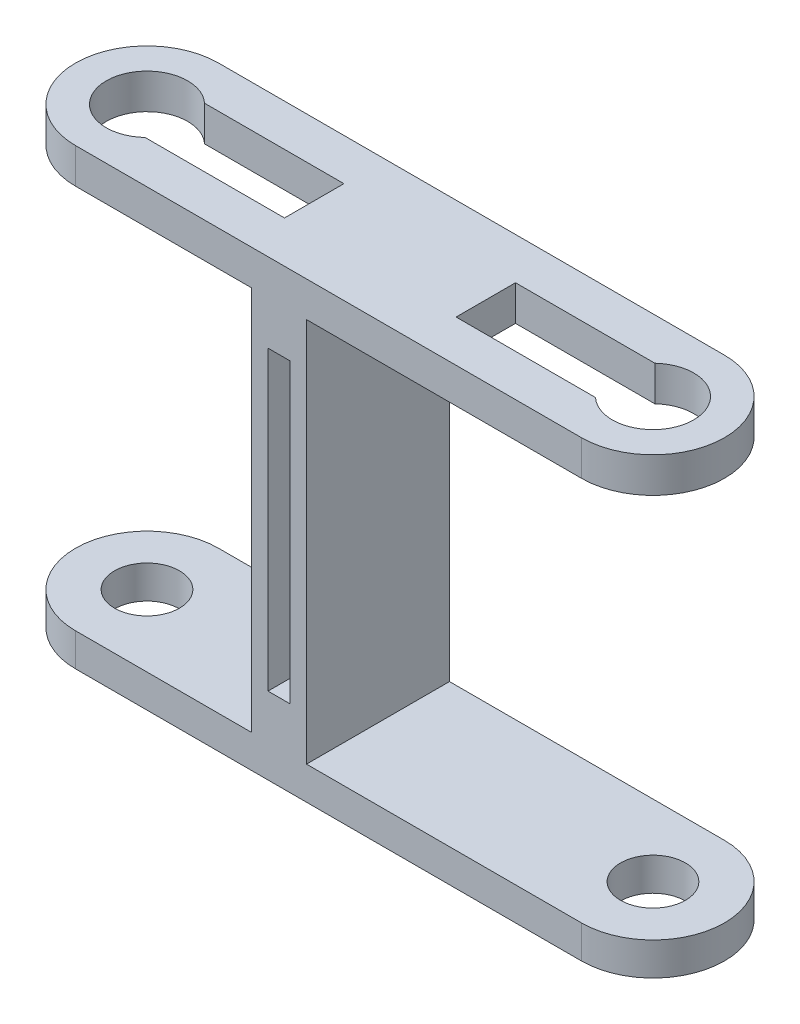
ISO-10303-21;
HEADER;
FILE_DESCRIPTION(('STEP AP214'),'2;1');
FILE_NAME('part.step','',(''),(''),'','','');
FILE_SCHEMA(('AUTOMOTIVE_DESIGN { 1 0 10303 214 1 1 1 1 }'));
ENDSEC;
DATA;
#1=APPLICATION_CONTEXT('core data for automotive mechanical design processes');
#2=APPLICATION_PROTOCOL_DEFINITION('international standard','automotive_design',2000,#1);
#3=PRODUCT_CONTEXT('',#1,'mechanical');
#4=PRODUCT('Part','Part','',(#3));
#5=PRODUCT_RELATED_PRODUCT_CATEGORY('part','',(#4));
#6=PRODUCT_DEFINITION_FORMATION('','',#4);
#7=PRODUCT_DEFINITION_CONTEXT('part definition',#1,'design');
#8=PRODUCT_DEFINITION('design','',#6,#7);
#9=PRODUCT_DEFINITION_SHAPE('','',#8);
#10=(LENGTH_UNIT() NAMED_UNIT(*) SI_UNIT(.MILLI.,.METRE.));
#11=(NAMED_UNIT(*) PLANE_ANGLE_UNIT() SI_UNIT($,.RADIAN.));
#12=(NAMED_UNIT(*) SI_UNIT($,.STERADIAN.) SOLID_ANGLE_UNIT());
#13=UNCERTAINTY_MEASURE_WITH_UNIT(LENGTH_MEASURE(1.E-05),#10,'distance_accuracy_value','');
#14=(GEOMETRIC_REPRESENTATION_CONTEXT(3) GLOBAL_UNCERTAINTY_ASSIGNED_CONTEXT((#13)) GLOBAL_UNIT_ASSIGNED_CONTEXT((#10,
#11,#12)) REPRESENTATION_CONTEXT('',''));
#15=CARTESIAN_POINT('',(0.,0.,0.));
#16=DIRECTION('',(0.,0.,1.));
#17=DIRECTION('',(1.,0.,0.));
#18=AXIS2_PLACEMENT_3D('',#15,#16,#17);
#19=CARTESIAN_POINT('',(0.,41.5,0.));
#20=DIRECTION('',(0.,1.,0.));
#21=DIRECTION('',(0.,0.,1.));
#22=AXIS2_PLACEMENT_3D('',#19,#20,#21);
#23=PLANE('',#22);
#24=CARTESIAN_POINT('',(46.,41.5,0.));
#25=DIRECTION('',(0.,1.,0.));
#26=DIRECTION('',(0.,0.,1.));
#27=AXIS2_PLACEMENT_3D('',#24,#25,#26);
#28=CIRCLE('',#27,3.7);
#29=CARTESIAN_POINT('',(43.4701778718653,41.5,2.7));
#30=VERTEX_POINT('',#29);
#31=CARTESIAN_POINT('',(43.4701778718653,41.5,-2.7));
#32=VERTEX_POINT('',#31);
#33=EDGE_CURVE('E391',#30,#32,#28,.T.);
#34=ORIENTED_EDGE('',*,*,#33,.T.);
#35=DIRECTION('',(-1.,0.,0.));
#36=VECTOR('',#35,1.);
#37=CARTESIAN_POINT('',(30.8,41.5,-2.7));
#38=LINE('',#37,#36);
#39=CARTESIAN_POINT('',(30.8,41.5,-2.7));
#40=VERTEX_POINT('',#39);
#41=EDGE_CURVE('E364',#32,#40,#38,.T.);
#42=ORIENTED_EDGE('',*,*,#41,.T.);
#43=DIRECTION('',(0.,0.,1.));
#44=VECTOR('',#43,1.);
#45=CARTESIAN_POINT('',(30.8,41.5,2.7));
#46=LINE('',#45,#44);
#47=CARTESIAN_POINT('',(30.8,41.5,2.7));
#48=VERTEX_POINT('',#47);
#49=EDGE_CURVE('E355',#40,#48,#46,.T.);
#50=ORIENTED_EDGE('',*,*,#49,.T.);
#51=DIRECTION('',(1.,0.,0.));
#52=VECTOR('',#51,1.);
#53=CARTESIAN_POINT('',(30.8,41.5,2.7));
#54=LINE('',#53,#52);
#55=EDGE_CURVE('E359',#48,#30,#54,.T.);
#56=ORIENTED_EDGE('',*,*,#55,.T.);
#57=EDGE_LOOP('',(#34,#42,#50,#56));
#58=FACE_BOUND('',#57,.T.);
#59=DIRECTION('',(0.,0.,1.));
#60=VECTOR('',#59,1.);
#61=CARTESIAN_POINT('',(21.,41.5,0.));
#62=LINE('',#61,#60);
#63=CARTESIAN_POINT('',(21.,41.5,-6.5));
#64=VERTEX_POINT('',#63);
#65=CARTESIAN_POINT('',(21.,41.5,6.5));
#66=VERTEX_POINT('',#65);
#67=EDGE_CURVE('E320',#64,#66,#62,.T.);
#68=ORIENTED_EDGE('',*,*,#67,.F.);
#69=DIRECTION('',(-1.,0.,0.));
#70=VECTOR('',#69,1.);
#71=CARTESIAN_POINT('',(0.,41.5,-6.5));
#72=LINE('',#71,#70);
#73=CARTESIAN_POINT('',(46.,41.5,-6.5));
#74=VERTEX_POINT('',#73);
#75=EDGE_CURVE('E409',#74,#64,#72,.T.);
#76=ORIENTED_EDGE('',*,*,#75,.F.);
#77=CARTESIAN_POINT('',(46.,41.5,0.));
#78=DIRECTION('',(0.,1.,0.));
#79=DIRECTION('',(0.,0.,1.));
#80=AXIS2_PLACEMENT_3D('',#77,#78,#79);
#81=CIRCLE('',#80,6.5);
#82=CARTESIAN_POINT('',(46.,41.5,6.5));
#83=VERTEX_POINT('',#82);
#84=EDGE_CURVE('E386',#83,#74,#81,.T.);
#85=ORIENTED_EDGE('',*,*,#84,.F.);
#86=DIRECTION('',(1.,0.,0.));
#87=VECTOR('',#86,1.);
#88=CARTESIAN_POINT('',(0.,41.5,6.5));
#89=LINE('',#88,#87);
#90=EDGE_CURVE('E402',#66,#83,#89,.T.);
#91=ORIENTED_EDGE('',*,*,#90,.F.);
#92=EDGE_LOOP('',(#68,#76,#85,#91));
#93=FACE_BOUND('',#92,.T.);
#94=ADVANCED_FACE('F39',(#58,#93),#23,.F.);
#95=CARTESIAN_POINT('',(0.,44.7,0.));
#96=DIRECTION('',(0.,-1.,0.));
#97=DIRECTION('',(0.,0.,-1.));
#98=AXIS2_PLACEMENT_3D('',#95,#96,#97);
#99=CYLINDRICAL_SURFACE('',#98,6.5);
#100=DIRECTION('',(0.,-1.,0.));
#101=VECTOR('',#100,1.);
#102=CARTESIAN_POINT('',(0.,44.7,6.5));
#103=LINE('',#102,#101);
#104=CARTESIAN_POINT('',(0.,44.7,6.5));
#105=VERTEX_POINT('',#104);
#106=CARTESIAN_POINT('',(0.,41.5,6.5));
#107=VERTEX_POINT('',#106);
#108=EDGE_CURVE('E432',#105,#107,#103,.T.);
#109=ORIENTED_EDGE('',*,*,#108,.F.);
#110=CARTESIAN_POINT('',(0.,44.7,0.));
#111=DIRECTION('',(0.,1.,0.));
#112=DIRECTION('',(0.,0.,1.));
#113=AXIS2_PLACEMENT_3D('',#110,#111,#112);
#114=CIRCLE('',#113,6.5);
#115=CARTESIAN_POINT('',(0.,44.7,-6.5));
#116=VERTEX_POINT('',#115);
#117=EDGE_CURVE('E437',#116,#105,#114,.T.);
#118=ORIENTED_EDGE('',*,*,#117,.F.);
#119=DIRECTION('',(0.,-1.,0.));
#120=VECTOR('',#119,1.);
#121=CARTESIAN_POINT('',(0.,44.7,-6.5));
#122=LINE('',#121,#120);
#123=CARTESIAN_POINT('',(0.,41.5,-6.5));
#124=VERTEX_POINT('',#123);
#125=EDGE_CURVE('E412',#116,#124,#122,.T.);
#126=ORIENTED_EDGE('',*,*,#125,.T.);
#127=CARTESIAN_POINT('',(0.,41.5,0.));
#128=DIRECTION('',(0.,1.,0.));
#129=DIRECTION('',(0.,0.,1.));
#130=AXIS2_PLACEMENT_3D('',#127,#128,#129);
#131=CIRCLE('',#130,6.5);
#132=EDGE_CURVE('E436',#124,#107,#131,.T.);
#133=ORIENTED_EDGE('',*,*,#132,.T.);
#134=EDGE_LOOP('',(#109,#118,#126,#133));
#135=FACE_BOUND('',#134,.T.);
#136=ADVANCED_FACE('F41',(#135),#99,.T.);
#137=CARTESIAN_POINT('',(0.,44.7,0.));
#138=DIRECTION('',(0.,1.,0.));
#139=DIRECTION('',(0.,0.,1.));
#140=AXIS2_PLACEMENT_3D('',#137,#138,#139);
#141=PLANE('',#140);
#142=DIRECTION('',(1.,0.,0.));
#143=VECTOR('',#142,1.);
#144=CARTESIAN_POINT('',(0.,44.7,6.5));
#145=LINE('',#144,#143);
#146=CARTESIAN_POINT('',(46.,44.7,6.5));
#147=VERTEX_POINT('',#146);
#148=EDGE_CURVE('E405',#105,#147,#145,.T.);
#149=ORIENTED_EDGE('',*,*,#148,.T.);
#150=CARTESIAN_POINT('',(46.,44.7,0.));
#151=DIRECTION('',(0.,1.,0.));
#152=DIRECTION('',(0.,0.,1.));
#153=AXIS2_PLACEMENT_3D('',#150,#151,#152);
#154=CIRCLE('',#153,6.5);
#155=CARTESIAN_POINT('',(46.,44.7,-6.5));
#156=VERTEX_POINT('',#155);
#157=EDGE_CURVE('E398',#147,#156,#154,.T.);
#158=ORIENTED_EDGE('',*,*,#157,.T.);
#159=DIRECTION('',(-1.,0.,0.));
#160=VECTOR('',#159,1.);
#161=CARTESIAN_POINT('',(0.,44.7,-6.5));
#162=LINE('',#161,#160);
#163=EDGE_CURVE('E408',#156,#116,#162,.T.);
#164=ORIENTED_EDGE('',*,*,#163,.T.);
#165=ORIENTED_EDGE('',*,*,#117,.T.);
#166=EDGE_LOOP('',(#149,#158,#164,#165));
#167=FACE_BOUND('',#166,.T.);
#168=DIRECTION('',(-1.,0.,0.));
#169=VECTOR('',#168,1.);
#170=CARTESIAN_POINT('',(0.,44.7,-2.7));
#171=LINE('',#170,#169);
#172=CARTESIAN_POINT('',(15.2,44.7,-2.7));
#173=VERTEX_POINT('',#172);
#174=CARTESIAN_POINT('',(2.5298221281347,44.7,-2.7));
#175=VERTEX_POINT('',#174);
#176=EDGE_CURVE('E329',#173,#175,#171,.T.);
#177=ORIENTED_EDGE('',*,*,#176,.F.);
#178=DIRECTION('',(0.,0.,-1.));
#179=VECTOR('',#178,1.);
#180=CARTESIAN_POINT('',(15.2,44.7,2.7));
#181=LINE('',#180,#179);
#182=CARTESIAN_POINT('',(15.2,44.7,2.7));
#183=VERTEX_POINT('',#182);
#184=EDGE_CURVE('E341',#183,#173,#181,.T.);
#185=ORIENTED_EDGE('',*,*,#184,.F.);
#186=DIRECTION('',(1.,0.,0.));
#187=VECTOR('',#186,1.);
#188=CARTESIAN_POINT('',(0.,44.7,2.7));
#189=LINE('',#188,#187);
#190=CARTESIAN_POINT('',(2.5298221281347,44.7,2.7));
#191=VERTEX_POINT('',#190);
#192=EDGE_CURVE('E338',#191,#183,#189,.T.);
#193=ORIENTED_EDGE('',*,*,#192,.F.);
#194=CARTESIAN_POINT('',(0.,44.7,0.));
#195=DIRECTION('',(0.,1.,0.));
#196=DIRECTION('',(0.,0.,1.));
#197=AXIS2_PLACEMENT_3D('',#194,#195,#196);
#198=CIRCLE('',#197,3.7);
#199=EDGE_CURVE('E387',#175,#191,#198,.T.);
#200=ORIENTED_EDGE('',*,*,#199,.F.);
#201=EDGE_LOOP('',(#177,#185,#193,#200));
#202=FACE_BOUND('',#201,.T.);
#203=DIRECTION('',(-1.,0.,0.));
#204=VECTOR('',#203,1.);
#205=CARTESIAN_POINT('',(30.8,44.7,-2.7));
#206=LINE('',#205,#204);
#207=CARTESIAN_POINT('',(43.4701778718653,44.7,-2.7));
#208=VERTEX_POINT('',#207);
#209=CARTESIAN_POINT('',(30.8,44.7,-2.7));
#210=VERTEX_POINT('',#209);
#211=EDGE_CURVE('E360',#208,#210,#206,.T.);
#212=ORIENTED_EDGE('',*,*,#211,.F.);
#213=CARTESIAN_POINT('',(46.,44.7,0.));
#214=DIRECTION('',(0.,1.,0.));
#215=DIRECTION('',(0.,0.,1.));
#216=AXIS2_PLACEMENT_3D('',#213,#214,#215);
#217=CIRCLE('',#216,3.7);
#218=CARTESIAN_POINT('',(43.4701778718653,44.7,2.7));
#219=VERTEX_POINT('',#218);
#220=EDGE_CURVE('E351',#219,#208,#217,.T.);
#221=ORIENTED_EDGE('',*,*,#220,.F.);
#222=DIRECTION('',(1.,0.,0.));
#223=VECTOR('',#222,1.);
#224=CARTESIAN_POINT('',(30.8,44.7,2.7));
#225=LINE('',#224,#223);
#226=CARTESIAN_POINT('',(30.8,44.7,2.7));
#227=VERTEX_POINT('',#226);
#228=EDGE_CURVE('E372',#227,#219,#225,.T.);
#229=ORIENTED_EDGE('',*,*,#228,.F.);
#230=DIRECTION('',(0.,0.,1.));
#231=VECTOR('',#230,1.);
#232=CARTESIAN_POINT('',(30.8,44.7,2.7));
#233=LINE('',#232,#231);
#234=EDGE_CURVE('E323',#210,#227,#233,.T.);
#235=ORIENTED_EDGE('',*,*,#234,.F.);
#236=EDGE_LOOP('',(#212,#221,#229,#235));
#237=FACE_BOUND('',#236,.T.);
#238=ADVANCED_FACE('F495',(#167,#202,#237),#141,.T.);
#239=DIRECTION('',(0.,0.,-1.));
#240=VECTOR('',#239,1.);
#241=CARTESIAN_POINT('',(15.2,41.5,2.7));
#242=LINE('',#241,#240);
#243=CARTESIAN_POINT('',(15.2,41.5,2.7));
#244=VERTEX_POINT('',#243);
#245=CARTESIAN_POINT('',(15.2,41.5,-2.7));
#246=VERTEX_POINT('',#245);
#247=EDGE_CURVE('E328',#244,#246,#242,.T.);
#248=ORIENTED_EDGE('',*,*,#247,.T.);
#249=DIRECTION('',(-1.,0.,0.));
#250=VECTOR('',#249,1.);
#251=CARTESIAN_POINT('',(0.,41.5,-2.7));
#252=LINE('',#251,#250);
#253=CARTESIAN_POINT('',(2.5298221281347,41.5,-2.7));
#254=VERTEX_POINT('',#253);
#255=EDGE_CURVE('E333',#246,#254,#252,.T.);
#256=ORIENTED_EDGE('',*,*,#255,.T.);
#257=CARTESIAN_POINT('',(0.,41.5,0.));
#258=DIRECTION('',(0.,1.,0.));
#259=DIRECTION('',(0.,0.,1.));
#260=AXIS2_PLACEMENT_3D('',#257,#258,#259);
#261=CIRCLE('',#260,3.7);
#262=CARTESIAN_POINT('',(2.5298221281347,41.5,2.7));
#263=VERTEX_POINT('',#262);
#264=EDGE_CURVE('E382',#254,#263,#261,.T.);
#265=ORIENTED_EDGE('',*,*,#264,.T.);
#266=DIRECTION('',(1.,0.,0.));
#267=VECTOR('',#266,1.);
#268=CARTESIAN_POINT('',(0.,41.5,2.7));
#269=LINE('',#268,#267);
#270=EDGE_CURVE('E324',#263,#244,#269,.T.);
#271=ORIENTED_EDGE('',*,*,#270,.T.);
#272=EDGE_LOOP('',(#248,#256,#265,#271));
#273=FACE_BOUND('',#272,.T.);
#274=CARTESIAN_POINT('',(16.,41.5,-6.5));
#275=VERTEX_POINT('',#274);
#276=EDGE_CURVE('E417',#275,#124,#72,.T.);
#277=ORIENTED_EDGE('',*,*,#276,.F.);
#278=DIRECTION('',(0.,0.,1.));
#279=VECTOR('',#278,1.);
#280=CARTESIAN_POINT('',(16.,41.5,0.));
#281=LINE('',#280,#279);
#282=CARTESIAN_POINT('',(16.,41.5,6.5));
#283=VERTEX_POINT('',#282);
#284=EDGE_CURVE('E316',#275,#283,#281,.T.);
#285=ORIENTED_EDGE('',*,*,#284,.T.);
#286=EDGE_CURVE('E413',#107,#283,#89,.T.);
#287=ORIENTED_EDGE('',*,*,#286,.F.);
#288=ORIENTED_EDGE('',*,*,#132,.F.);
#289=EDGE_LOOP('',(#277,#285,#287,#288));
#290=FACE_BOUND('',#289,.T.);
#291=ADVANCED_FACE('F491',(#273,#290),#23,.F.);
#292=CARTESIAN_POINT('',(0.,44.7,6.5));
#293=DIRECTION('',(0.,0.,-1.));
#294=DIRECTION('',(-1.,0.,0.));
#295=AXIS2_PLACEMENT_3D('',#292,#293,#294);
#296=PLANE('',#295);
#297=DIRECTION('',(1.,0.,0.));
#298=VECTOR('',#297,1.);
#299=CARTESIAN_POINT('',(17.5,10.5,6.5));
#300=LINE('',#299,#298);
#301=CARTESIAN_POINT('',(17.5,10.5,6.5));
#302=VERTEX_POINT('',#301);
#303=CARTESIAN_POINT('',(19.5,10.5,6.5));
#304=VERTEX_POINT('',#303);
#305=EDGE_CURVE('E214',#302,#304,#300,.T.);
#306=ORIENTED_EDGE('',*,*,#305,.F.);
#307=DIRECTION('',(0.,-1.,0.));
#308=VECTOR('',#307,1.);
#309=CARTESIAN_POINT('',(17.5,10.5,6.5));
#310=LINE('',#309,#308);
#311=CARTESIAN_POINT('',(17.5,37.5,6.5));
#312=VERTEX_POINT('',#311);
#313=EDGE_CURVE('E55',#312,#302,#310,.T.);
#314=ORIENTED_EDGE('',*,*,#313,.F.);
#315=DIRECTION('',(-1.,0.,0.));
#316=VECTOR('',#315,1.);
#317=CARTESIAN_POINT('',(17.5,37.5,6.5));
#318=LINE('',#317,#316);
#319=CARTESIAN_POINT('',(19.5,37.5,6.5));
#320=VERTEX_POINT('',#319);
#321=EDGE_CURVE('E222',#320,#312,#318,.T.);
#322=ORIENTED_EDGE('',*,*,#321,.F.);
#323=DIRECTION('',(0.,1.,0.));
#324=VECTOR('',#323,1.);
#325=CARTESIAN_POINT('',(19.5,10.5,6.5));
#326=LINE('',#325,#324);
#327=EDGE_CURVE('E204',#304,#320,#326,.T.);
#328=ORIENTED_EDGE('',*,*,#327,.F.);
#329=EDGE_LOOP('',(#306,#314,#322,#328));
#330=FACE_BOUND('',#329,.T.);
#331=DIRECTION('',(0.,-1.,0.));
#332=VECTOR('',#331,1.);
#333=CARTESIAN_POINT('',(16.,3.5,6.5));
#334=LINE('',#333,#332);
#335=CARTESIAN_POINT('',(16.,6.5,6.5));
#336=VERTEX_POINT('',#335);
#337=EDGE_CURVE('E297',#283,#336,#334,.T.);
#338=ORIENTED_EDGE('',*,*,#337,.T.);
#339=DIRECTION('',(1.,0.,0.));
#340=VECTOR('',#339,1.);
#341=CARTESIAN_POINT('',(0.,6.5,6.5));
#342=LINE('',#341,#340);
#343=CARTESIAN_POINT('',(0.,6.5,6.5));
#344=VERTEX_POINT('',#343);
#345=EDGE_CURVE('E261',#344,#336,#342,.T.);
#346=ORIENTED_EDGE('',*,*,#345,.F.);
#347=DIRECTION('',(0.,-1.,0.));
#348=VECTOR('',#347,1.);
#349=CARTESIAN_POINT('',(0.,6.5,6.5));
#350=LINE('',#349,#348);
#351=CARTESIAN_POINT('',(0.,3.5,6.5));
#352=VERTEX_POINT('',#351);
#353=EDGE_CURVE('E281',#344,#352,#350,.T.);
#354=ORIENTED_EDGE('',*,*,#353,.T.);
#355=DIRECTION('',(-1.,0.,0.));
#356=VECTOR('',#355,1.);
#357=CARTESIAN_POINT('',(21.,3.5,6.5));
#358=LINE('',#357,#356);
#359=CARTESIAN_POINT('',(46.,3.5,6.5));
#360=VERTEX_POINT('',#359);
#361=EDGE_CURVE('E313',#360,#352,#358,.T.);
#362=ORIENTED_EDGE('',*,*,#361,.F.);
#363=DIRECTION('',(0.,-1.,0.));
#364=VECTOR('',#363,1.);
#365=CARTESIAN_POINT('',(46.,6.5,6.5));
#366=LINE('',#365,#364);
#367=CARTESIAN_POINT('',(46.,6.5,6.5));
#368=VERTEX_POINT('',#367);
#369=EDGE_CURVE('E277',#368,#360,#366,.T.);
#370=ORIENTED_EDGE('',*,*,#369,.F.);
#371=CARTESIAN_POINT('',(21.,6.5,6.5));
#372=VERTEX_POINT('',#371);
#373=EDGE_CURVE('E257',#372,#368,#342,.T.);
#374=ORIENTED_EDGE('',*,*,#373,.F.);
#375=DIRECTION('',(0.,-1.,0.));
#376=VECTOR('',#375,1.);
#377=CARTESIAN_POINT('',(21.,3.5,6.5));
#378=LINE('',#377,#376);
#379=EDGE_CURVE('E298',#66,#372,#378,.T.);
#380=ORIENTED_EDGE('',*,*,#379,.F.);
#381=ORIENTED_EDGE('',*,*,#90,.T.);
#382=DIRECTION('',(0.,-1.,0.));
#383=VECTOR('',#382,1.);
#384=CARTESIAN_POINT('',(46.,44.7,6.5));
#385=LINE('',#384,#383);
#386=EDGE_CURVE('E428',#147,#83,#385,.T.);
#387=ORIENTED_EDGE('',*,*,#386,.F.);
#388=ORIENTED_EDGE('',*,*,#148,.F.);
#389=ORIENTED_EDGE('',*,*,#108,.T.);
#390=ORIENTED_EDGE('',*,*,#286,.T.);
#391=EDGE_LOOP('',(#338,#346,#354,#362,#370,#374,#380,#381,#387,#388,#389,#390));
#392=FACE_BOUND('',#391,.T.);
#393=ADVANCED_FACE('F219',(#330,#392),#296,.F.);
#394=CARTESIAN_POINT('',(0.,44.7,-6.5));
#395=DIRECTION('',(0.,0.,1.));
#396=DIRECTION('',(1.,0.,0.));
#397=AXIS2_PLACEMENT_3D('',#394,#395,#396);
#398=PLANE('',#397);
#399=DIRECTION('',(-1.,0.,0.));
#400=VECTOR('',#399,1.);
#401=CARTESIAN_POINT('',(0.,37.5,-6.5));
#402=LINE('',#401,#400);
#403=CARTESIAN_POINT('',(19.5,37.5,-6.5));
#404=VERTEX_POINT('',#403);
#405=CARTESIAN_POINT('',(17.5,37.5,-6.5));
#406=VERTEX_POINT('',#405);
#407=EDGE_CURVE('E48',#404,#406,#402,.T.);
#408=ORIENTED_EDGE('',*,*,#407,.T.);
#409=DIRECTION('',(0.,-1.,0.));
#410=VECTOR('',#409,1.);
#411=CARTESIAN_POINT('',(17.5,44.7,-6.5));
#412=LINE('',#411,#410);
#413=CARTESIAN_POINT('',(17.5,10.5,-6.5));
#414=VERTEX_POINT('',#413);
#415=EDGE_CURVE('E11',#406,#414,#412,.T.);
#416=ORIENTED_EDGE('',*,*,#415,.T.);
#417=DIRECTION('',(1.,0.,0.));
#418=VECTOR('',#417,1.);
#419=CARTESIAN_POINT('',(0.,10.5,-6.5));
#420=LINE('',#419,#418);
#421=CARTESIAN_POINT('',(19.5,10.5,-6.5));
#422=VERTEX_POINT('',#421);
#423=EDGE_CURVE('E463',#414,#422,#420,.T.);
#424=ORIENTED_EDGE('',*,*,#423,.T.);
#425=DIRECTION('',(0.,1.,0.));
#426=VECTOR('',#425,1.);
#427=CARTESIAN_POINT('',(19.5,44.7,-6.5));
#428=LINE('',#427,#426);
#429=EDGE_CURVE('E207',#422,#404,#428,.T.);
#430=ORIENTED_EDGE('',*,*,#429,.T.);
#431=EDGE_LOOP('',(#408,#416,#424,#430));
#432=FACE_BOUND('',#431,.T.);
#433=DIRECTION('',(0.,1.,0.));
#434=VECTOR('',#433,1.);
#435=CARTESIAN_POINT('',(21.,3.5,-6.5));
#436=LINE('',#435,#434);
#437=CARTESIAN_POINT('',(21.,6.5,-6.5));
#438=VERTEX_POINT('',#437);
#439=EDGE_CURVE('E301',#438,#64,#436,.T.);
#440=ORIENTED_EDGE('',*,*,#439,.F.);
#441=DIRECTION('',(-1.,0.,0.));
#442=VECTOR('',#441,1.);
#443=CARTESIAN_POINT('',(0.,6.5,-6.5));
#444=LINE('',#443,#442);
#445=CARTESIAN_POINT('',(46.,6.5,-6.5));
#446=VERTEX_POINT('',#445);
#447=EDGE_CURVE('E265',#446,#438,#444,.T.);
#448=ORIENTED_EDGE('',*,*,#447,.F.);
#449=DIRECTION('',(0.,-1.,0.));
#450=VECTOR('',#449,1.);
#451=CARTESIAN_POINT('',(46.,6.5,-6.5));
#452=LINE('',#451,#450);
#453=CARTESIAN_POINT('',(46.,3.5,-6.5));
#454=VERTEX_POINT('',#453);
#455=EDGE_CURVE('E273',#446,#454,#452,.T.);
#456=ORIENTED_EDGE('',*,*,#455,.T.);
#457=DIRECTION('',(-1.,0.,0.));
#458=VECTOR('',#457,1.);
#459=CARTESIAN_POINT('',(21.,3.5,-6.5));
#460=LINE('',#459,#458);
#461=CARTESIAN_POINT('',(0.,3.5,-6.5));
#462=VERTEX_POINT('',#461);
#463=EDGE_CURVE('E305',#454,#462,#460,.T.);
#464=ORIENTED_EDGE('',*,*,#463,.T.);
#465=DIRECTION('',(0.,-1.,0.));
#466=VECTOR('',#465,1.);
#467=CARTESIAN_POINT('',(0.,6.5,-6.5));
#468=LINE('',#467,#466);
#469=CARTESIAN_POINT('',(0.,6.5,-6.5));
#470=VERTEX_POINT('',#469);
#471=EDGE_CURVE('E269',#470,#462,#468,.T.);
#472=ORIENTED_EDGE('',*,*,#471,.F.);
#473=CARTESIAN_POINT('',(16.,6.5,-6.5));
#474=VERTEX_POINT('',#473);
#475=EDGE_CURVE('E264',#474,#470,#444,.T.);
#476=ORIENTED_EDGE('',*,*,#475,.F.);
#477=DIRECTION('',(0.,1.,0.));
#478=VECTOR('',#477,1.);
#479=CARTESIAN_POINT('',(16.,3.5,-6.5));
#480=LINE('',#479,#478);
#481=EDGE_CURVE('E302',#474,#275,#480,.T.);
#482=ORIENTED_EDGE('',*,*,#481,.T.);
#483=ORIENTED_EDGE('',*,*,#276,.T.);
#484=ORIENTED_EDGE('',*,*,#125,.F.);
#485=ORIENTED_EDGE('',*,*,#163,.F.);
#486=DIRECTION('',(0.,-1.,0.));
#487=VECTOR('',#486,1.);
#488=CARTESIAN_POINT('',(46.,44.7,-6.5));
#489=LINE('',#488,#487);
#490=EDGE_CURVE('E424',#156,#74,#489,.T.);
#491=ORIENTED_EDGE('',*,*,#490,.T.);
#492=ORIENTED_EDGE('',*,*,#75,.T.);
#493=EDGE_LOOP('',(#440,#448,#456,#464,#472,#476,#482,#483,#484,#485,#491,#492));
#494=FACE_BOUND('',#493,.T.);
#495=ADVANCED_FACE('F470',(#432,#494),#398,.F.);
#496=CARTESIAN_POINT('',(46.,44.7,0.));
#497=DIRECTION('',(0.,-1.,0.));
#498=DIRECTION('',(0.,0.,-1.));
#499=AXIS2_PLACEMENT_3D('',#496,#497,#498);
#500=CYLINDRICAL_SURFACE('',#499,6.5);
#501=ORIENTED_EDGE('',*,*,#157,.F.);
#502=ORIENTED_EDGE('',*,*,#386,.T.);
#503=ORIENTED_EDGE('',*,*,#84,.T.);
#504=ORIENTED_EDGE('',*,*,#490,.F.);
#505=EDGE_LOOP('',(#501,#502,#503,#504));
#506=FACE_BOUND('',#505,.T.);
#507=ADVANCED_FACE('F546',(#506),#500,.T.);
#508=CARTESIAN_POINT('',(46.,41.5,0.));
#509=DIRECTION('',(0.,1.,0.));
#510=DIRECTION('',(0.,0.,1.));
#511=AXIS2_PLACEMENT_3D('',#508,#509,#510);
#512=CYLINDRICAL_SURFACE('',#511,3.7);
#513=ORIENTED_EDGE('',*,*,#220,.T.);
#514=DIRECTION('',(0.,1.,0.));
#515=VECTOR('',#514,1.);
#516=CARTESIAN_POINT('',(43.4701778718653,41.5,-2.7));
#517=LINE('',#516,#515);
#518=EDGE_CURVE('E455',#208,#32,#517,.F.);
#519=ORIENTED_EDGE('',*,*,#518,.T.);
#520=ORIENTED_EDGE('',*,*,#33,.F.);
#521=DIRECTION('',(0.,1.,0.));
#522=VECTOR('',#521,1.);
#523=CARTESIAN_POINT('',(43.4701778718653,41.5,2.7));
#524=LINE('',#523,#522);
#525=EDGE_CURVE('E451',#30,#219,#524,.T.);
#526=ORIENTED_EDGE('',*,*,#525,.T.);
#527=EDGE_LOOP('',(#513,#519,#520,#526));
#528=FACE_BOUND('',#527,.T.);
#529=ADVANCED_FACE('F603',(#528),#512,.F.);
#530=CARTESIAN_POINT('',(0.,41.5,0.));
#531=DIRECTION('',(0.,1.,0.));
#532=DIRECTION('',(0.,0.,1.));
#533=AXIS2_PLACEMENT_3D('',#530,#531,#532);
#534=CYLINDRICAL_SURFACE('',#533,3.7);
#535=ORIENTED_EDGE('',*,*,#264,.F.);
#536=DIRECTION('',(0.,1.,0.));
#537=VECTOR('',#536,1.);
#538=CARTESIAN_POINT('',(2.5298221281347,41.5,-2.7));
#539=LINE('',#538,#537);
#540=EDGE_CURVE('E447',#254,#175,#539,.T.);
#541=ORIENTED_EDGE('',*,*,#540,.T.);
#542=ORIENTED_EDGE('',*,*,#199,.T.);
#543=DIRECTION('',(0.,1.,0.));
#544=VECTOR('',#543,1.);
#545=CARTESIAN_POINT('',(2.5298221281347,41.5,2.7));
#546=LINE('',#545,#544);
#547=EDGE_CURVE('E441',#191,#263,#546,.F.);
#548=ORIENTED_EDGE('',*,*,#547,.T.);
#549=EDGE_LOOP('',(#535,#541,#542,#548));
#550=FACE_BOUND('',#549,.T.);
#551=ADVANCED_FACE('F581',(#550),#534,.F.);
#552=CARTESIAN_POINT('',(0.,41.5,-2.7));
#553=DIRECTION('',(0.,0.,-1.));
#554=DIRECTION('',(-1.,0.,0.));
#555=AXIS2_PLACEMENT_3D('',#552,#553,#554);
#556=PLANE('',#555);
#557=ORIENTED_EDGE('',*,*,#255,.F.);
#558=DIRECTION('',(0.,1.,0.));
#559=VECTOR('',#558,1.);
#560=CARTESIAN_POINT('',(15.2,41.5,-2.7));
#561=LINE('',#560,#559);
#562=EDGE_CURVE('E348',#246,#173,#561,.T.);
#563=ORIENTED_EDGE('',*,*,#562,.T.);
#564=ORIENTED_EDGE('',*,*,#176,.T.);
#565=ORIENTED_EDGE('',*,*,#540,.F.);
#566=EDGE_LOOP('',(#557,#563,#564,#565));
#567=FACE_BOUND('',#566,.T.);
#568=ADVANCED_FACE('F577',(#567),#556,.F.);
#569=CARTESIAN_POINT('',(0.,41.5,2.7));
#570=DIRECTION('',(0.,0.,1.));
#571=DIRECTION('',(1.,0.,0.));
#572=AXIS2_PLACEMENT_3D('',#569,#570,#571);
#573=PLANE('',#572);
#574=ORIENTED_EDGE('',*,*,#192,.T.);
#575=DIRECTION('',(0.,1.,0.));
#576=VECTOR('',#575,1.);
#577=CARTESIAN_POINT('',(15.2,41.5,2.7));
#578=LINE('',#577,#576);
#579=EDGE_CURVE('E337',#244,#183,#578,.T.);
#580=ORIENTED_EDGE('',*,*,#579,.F.);
#581=ORIENTED_EDGE('',*,*,#270,.F.);
#582=ORIENTED_EDGE('',*,*,#547,.F.);
#583=EDGE_LOOP('',(#574,#580,#581,#582));
#584=FACE_BOUND('',#583,.T.);
#585=ADVANCED_FACE('F580',(#584),#573,.F.);
#586=CARTESIAN_POINT('',(15.2,41.5,2.7));
#587=DIRECTION('',(1.,0.,0.));
#588=DIRECTION('',(0.,0.,-1.));
#589=AXIS2_PLACEMENT_3D('',#586,#587,#588);
#590=PLANE('',#589);
#591=ORIENTED_EDGE('',*,*,#184,.T.);
#592=ORIENTED_EDGE('',*,*,#562,.F.);
#593=ORIENTED_EDGE('',*,*,#247,.F.);
#594=ORIENTED_EDGE('',*,*,#579,.T.);
#595=EDGE_LOOP('',(#591,#592,#593,#594));
#596=FACE_BOUND('',#595,.T.);
#597=ADVANCED_FACE('F583',(#596),#590,.F.);
#598=CARTESIAN_POINT('',(30.8,41.5,-2.7));
#599=DIRECTION('',(0.,0.,-1.));
#600=DIRECTION('',(-1.,0.,0.));
#601=AXIS2_PLACEMENT_3D('',#598,#599,#600);
#602=PLANE('',#601);
#603=ORIENTED_EDGE('',*,*,#211,.T.);
#604=DIRECTION('',(0.,1.,0.));
#605=VECTOR('',#604,1.);
#606=CARTESIAN_POINT('',(30.8,41.5,-2.7));
#607=LINE('',#606,#605);
#608=EDGE_CURVE('E342',#40,#210,#607,.T.);
#609=ORIENTED_EDGE('',*,*,#608,.F.);
#610=ORIENTED_EDGE('',*,*,#41,.F.);
#611=ORIENTED_EDGE('',*,*,#518,.F.);
#612=EDGE_LOOP('',(#603,#609,#610,#611));
#613=FACE_BOUND('',#612,.T.);
#614=ADVANCED_FACE('F586',(#613),#602,.F.);
#615=CARTESIAN_POINT('',(30.8,41.5,2.7));
#616=DIRECTION('',(0.,0.,1.));
#617=DIRECTION('',(1.,0.,0.));
#618=AXIS2_PLACEMENT_3D('',#615,#616,#617);
#619=PLANE('',#618);
#620=ORIENTED_EDGE('',*,*,#55,.F.);
#621=DIRECTION('',(0.,1.,0.));
#622=VECTOR('',#621,1.);
#623=CARTESIAN_POINT('',(30.8,41.5,2.7));
#624=LINE('',#623,#622);
#625=EDGE_CURVE('E368',#48,#227,#624,.T.);
#626=ORIENTED_EDGE('',*,*,#625,.T.);
#627=ORIENTED_EDGE('',*,*,#228,.T.);
#628=ORIENTED_EDGE('',*,*,#525,.F.);
#629=EDGE_LOOP('',(#620,#626,#627,#628));
#630=FACE_BOUND('',#629,.T.);
#631=ADVANCED_FACE('F593',(#630),#619,.F.);
#632=CARTESIAN_POINT('',(30.8,41.5,2.7));
#633=DIRECTION('',(-1.,0.,0.));
#634=DIRECTION('',(0.,0.,1.));
#635=AXIS2_PLACEMENT_3D('',#632,#633,#634);
#636=PLANE('',#635);
#637=ORIENTED_EDGE('',*,*,#234,.T.);
#638=ORIENTED_EDGE('',*,*,#625,.F.);
#639=ORIENTED_EDGE('',*,*,#49,.F.);
#640=ORIENTED_EDGE('',*,*,#608,.T.);
#641=EDGE_LOOP('',(#637,#638,#639,#640));
#642=FACE_BOUND('',#641,.T.);
#643=ADVANCED_FACE('F572',(#642),#636,.F.);
#644=CARTESIAN_POINT('',(21.,0.,0.));
#645=DIRECTION('',(-1.,0.,0.));
#646=DIRECTION('',(0.,0.,1.));
#647=AXIS2_PLACEMENT_3D('',#644,#645,#646);
#648=PLANE('',#647);
#649=ORIENTED_EDGE('',*,*,#379,.T.);
#650=DIRECTION('',(0.,0.,-1.));
#651=VECTOR('',#650,1.);
#652=CARTESIAN_POINT('',(21.,6.5,0.));
#653=LINE('',#652,#651);
#654=EDGE_CURVE('E290',#372,#438,#653,.T.);
#655=ORIENTED_EDGE('',*,*,#654,.T.);
#656=ORIENTED_EDGE('',*,*,#439,.T.);
#657=ORIENTED_EDGE('',*,*,#67,.T.);
#658=EDGE_LOOP('',(#649,#655,#656,#657));
#659=FACE_BOUND('',#658,.T.);
#660=ADVANCED_FACE('F540',(#659),#648,.F.);
#661=CARTESIAN_POINT('',(16.,0.,0.));
#662=DIRECTION('',(-1.,0.,0.));
#663=DIRECTION('',(0.,0.,1.));
#664=AXIS2_PLACEMENT_3D('',#661,#662,#663);
#665=PLANE('',#664);
#666=DIRECTION('',(0.,0.,-1.));
#667=VECTOR('',#666,1.);
#668=CARTESIAN_POINT('',(16.,6.5,0.));
#669=LINE('',#668,#667);
#670=EDGE_CURVE('E459',#336,#474,#669,.T.);
#671=ORIENTED_EDGE('',*,*,#670,.F.);
#672=ORIENTED_EDGE('',*,*,#337,.F.);
#673=ORIENTED_EDGE('',*,*,#284,.F.);
#674=ORIENTED_EDGE('',*,*,#481,.F.);
#675=EDGE_LOOP('',(#671,#672,#673,#674));
#676=FACE_BOUND('',#675,.T.);
#677=ADVANCED_FACE('F553',(#676),#665,.T.);
#678=CARTESIAN_POINT('',(21.,3.5,6.5));
#679=DIRECTION('',(0.,1.,0.));
#680=DIRECTION('',(0.,0.,1.));
#681=AXIS2_PLACEMENT_3D('',#678,#679,#680);
#682=PLANE('',#681);
#683=ORIENTED_EDGE('',*,*,#361,.T.);
#684=CARTESIAN_POINT('',(0.,3.5,0.));
#685=DIRECTION('',(0.,1.,0.));
#686=DIRECTION('',(0.,0.,1.));
#687=AXIS2_PLACEMENT_3D('',#684,#685,#686);
#688=CIRCLE('',#687,6.5);
#689=EDGE_CURVE('E285',#462,#352,#688,.T.);
#690=ORIENTED_EDGE('',*,*,#689,.F.);
#691=ORIENTED_EDGE('',*,*,#463,.F.);
#692=CARTESIAN_POINT('',(46.,3.5,0.));
#693=DIRECTION('',(0.,1.,0.));
#694=DIRECTION('',(0.,0.,1.));
#695=AXIS2_PLACEMENT_3D('',#692,#693,#694);
#696=CIRCLE('',#695,6.5);
#697=EDGE_CURVE('E241',#360,#454,#696,.T.);
#698=ORIENTED_EDGE('',*,*,#697,.F.);
#699=EDGE_LOOP('',(#683,#690,#691,#698));
#700=FACE_BOUND('',#699,.T.);
#701=CARTESIAN_POINT('',(0.,3.5,0.));
#702=DIRECTION('',(0.,1.,0.));
#703=DIRECTION('',(0.,0.,1.));
#704=AXIS2_PLACEMENT_3D('',#701,#702,#703);
#705=CIRCLE('',#704,2.95);
#706=CARTESIAN_POINT('',(0.,3.5,2.95));
#707=VERTEX_POINT('',#706);
#708=EDGE_CURVE('E237',#707,#707,#705,.T.);
#709=ORIENTED_EDGE('',*,*,#708,.T.);
#710=EDGE_LOOP('',(#709));
#711=FACE_BOUND('',#710,.T.);
#712=CARTESIAN_POINT('',(46.,3.5,0.));
#713=DIRECTION('',(0.,1.,0.));
#714=DIRECTION('',(0.,0.,1.));
#715=AXIS2_PLACEMENT_3D('',#712,#713,#714);
#716=CIRCLE('',#715,2.95);
#717=CARTESIAN_POINT('',(46.,3.5,2.95));
#718=VERTEX_POINT('',#717);
#719=EDGE_CURVE('E246',#718,#718,#716,.T.);
#720=ORIENTED_EDGE('',*,*,#719,.T.);
#721=EDGE_LOOP('',(#720));
#722=FACE_BOUND('',#721,.T.);
#723=ADVANCED_FACE('F531',(#700,#711,#722),#682,.F.);
#724=CARTESIAN_POINT('',(0.,3.5,0.));
#725=DIRECTION('',(0.,1.,0.));
#726=DIRECTION('',(0.,0.,1.));
#727=AXIS2_PLACEMENT_3D('',#724,#725,#726);
#728=CYLINDRICAL_SURFACE('',#727,2.95);
#729=ORIENTED_EDGE('',*,*,#708,.F.);
#730=EDGE_LOOP('',(#729));
#731=FACE_BOUND('',#730,.T.);
#732=CARTESIAN_POINT('',(0.,6.5,0.));
#733=DIRECTION('',(0.,1.,0.));
#734=DIRECTION('',(0.,0.,1.));
#735=AXIS2_PLACEMENT_3D('',#732,#733,#734);
#736=CIRCLE('',#735,2.95);
#737=CARTESIAN_POINT('',(0.,6.5,2.95));
#738=VERTEX_POINT('',#737);
#739=EDGE_CURVE('E242',#738,#738,#736,.T.);
#740=ORIENTED_EDGE('',*,*,#739,.T.);
#741=EDGE_LOOP('',(#740));
#742=FACE_BOUND('',#741,.T.);
#743=ADVANCED_FACE('F565',(#731,#742),#728,.F.);
#744=CARTESIAN_POINT('',(0.,6.5,0.));
#745=DIRECTION('',(0.,-1.,0.));
#746=DIRECTION('',(0.,0.,-1.));
#747=AXIS2_PLACEMENT_3D('',#744,#745,#746);
#748=CYLINDRICAL_SURFACE('',#747,6.5);
#749=ORIENTED_EDGE('',*,*,#353,.F.);
#750=CARTESIAN_POINT('',(0.,6.5,0.));
#751=DIRECTION('',(0.,1.,0.));
#752=DIRECTION('',(0.,0.,1.));
#753=AXIS2_PLACEMENT_3D('',#750,#751,#752);
#754=CIRCLE('',#753,6.5);
#755=EDGE_CURVE('E286',#470,#344,#754,.T.);
#756=ORIENTED_EDGE('',*,*,#755,.F.);
#757=ORIENTED_EDGE('',*,*,#471,.T.);
#758=ORIENTED_EDGE('',*,*,#689,.T.);
#759=EDGE_LOOP('',(#749,#756,#757,#758));
#760=FACE_BOUND('',#759,.T.);
#761=ADVANCED_FACE('F534',(#760),#748,.T.);
#762=CARTESIAN_POINT('',(0.,6.5,0.));
#763=DIRECTION('',(0.,1.,0.));
#764=DIRECTION('',(0.,0.,1.));
#765=AXIS2_PLACEMENT_3D('',#762,#763,#764);
#766=PLANE('',#765);
#767=ORIENTED_EDGE('',*,*,#739,.F.);
#768=EDGE_LOOP('',(#767));
#769=FACE_BOUND('',#768,.T.);
#770=ORIENTED_EDGE('',*,*,#345,.T.);
#771=ORIENTED_EDGE('',*,*,#670,.T.);
#772=ORIENTED_EDGE('',*,*,#475,.T.);
#773=ORIENTED_EDGE('',*,*,#755,.T.);
#774=EDGE_LOOP('',(#770,#771,#772,#773));
#775=FACE_BOUND('',#774,.T.);
#776=ADVANCED_FACE('F556',(#769,#775),#766,.T.);
#777=CARTESIAN_POINT('',(46.,6.5,0.));
#778=DIRECTION('',(0.,1.,0.));
#779=DIRECTION('',(0.,0.,1.));
#780=AXIS2_PLACEMENT_3D('',#777,#778,#779);
#781=CIRCLE('',#780,2.95);
#782=CARTESIAN_POINT('',(46.,6.5,2.95));
#783=VERTEX_POINT('',#782);
#784=EDGE_CURVE('E232',#783,#783,#781,.T.);
#785=ORIENTED_EDGE('',*,*,#784,.F.);
#786=EDGE_LOOP('',(#785));
#787=FACE_BOUND('',#786,.T.);
#788=ORIENTED_EDGE('',*,*,#654,.F.);
#789=ORIENTED_EDGE('',*,*,#373,.T.);
#790=CARTESIAN_POINT('',(46.,6.5,0.));
#791=DIRECTION('',(0.,1.,0.));
#792=DIRECTION('',(0.,0.,1.));
#793=AXIS2_PLACEMENT_3D('',#790,#791,#792);
#794=CIRCLE('',#793,6.5);
#795=EDGE_CURVE('E253',#368,#446,#794,.T.);
#796=ORIENTED_EDGE('',*,*,#795,.T.);
#797=ORIENTED_EDGE('',*,*,#447,.T.);
#798=EDGE_LOOP('',(#788,#789,#796,#797));
#799=FACE_BOUND('',#798,.T.);
#800=ADVANCED_FACE('F522',(#787,#799),#766,.T.);
#801=CARTESIAN_POINT('',(46.,6.5,0.));
#802=DIRECTION('',(0.,-1.,0.));
#803=DIRECTION('',(0.,0.,-1.));
#804=AXIS2_PLACEMENT_3D('',#801,#802,#803);
#805=CYLINDRICAL_SURFACE('',#804,6.5);
#806=ORIENTED_EDGE('',*,*,#795,.F.);
#807=ORIENTED_EDGE('',*,*,#369,.T.);
#808=ORIENTED_EDGE('',*,*,#697,.T.);
#809=ORIENTED_EDGE('',*,*,#455,.F.);
#810=EDGE_LOOP('',(#806,#807,#808,#809));
#811=FACE_BOUND('',#810,.T.);
#812=ADVANCED_FACE('F484',(#811),#805,.T.);
#813=CARTESIAN_POINT('',(46.,3.5,0.));
#814=DIRECTION('',(0.,1.,0.));
#815=DIRECTION('',(0.,0.,1.));
#816=AXIS2_PLACEMENT_3D('',#813,#814,#815);
#817=CYLINDRICAL_SURFACE('',#816,2.95);
#818=ORIENTED_EDGE('',*,*,#719,.F.);
#819=EDGE_LOOP('',(#818));
#820=FACE_BOUND('',#819,.T.);
#821=ORIENTED_EDGE('',*,*,#784,.T.);
#822=EDGE_LOOP('',(#821));
#823=FACE_BOUND('',#822,.T.);
#824=ADVANCED_FACE('F477',(#820,#823),#817,.F.);
#825=CARTESIAN_POINT('',(17.5,10.5,-6.52));
#826=DIRECTION('',(-1.,0.,0.));
#827=DIRECTION('',(0.,0.,1.));
#828=AXIS2_PLACEMENT_3D('',#825,#826,#827);
#829=PLANE('',#828);
#830=DIRECTION('',(0.,0.,1.));
#831=VECTOR('',#830,1.);
#832=CARTESIAN_POINT('',(17.5,37.5,-6.52));
#833=LINE('',#832,#831);
#834=EDGE_CURVE('E229',#406,#312,#833,.T.);
#835=ORIENTED_EDGE('',*,*,#834,.T.);
#836=ORIENTED_EDGE('',*,*,#313,.T.);
#837=DIRECTION('',(0.,0.,1.));
#838=VECTOR('',#837,1.);
#839=CARTESIAN_POINT('',(17.5,10.5,-6.52));
#840=LINE('',#839,#838);
#841=EDGE_CURVE('E211',#414,#302,#840,.T.);
#842=ORIENTED_EDGE('',*,*,#841,.F.);
#843=ORIENTED_EDGE('',*,*,#415,.F.);
#844=EDGE_LOOP('',(#835,#836,#842,#843));
#845=FACE_BOUND('',#844,.T.);
#846=ADVANCED_FACE('F475',(#845),#829,.F.);
#847=CARTESIAN_POINT('',(17.5,37.5,-6.52));
#848=DIRECTION('',(0.,1.,0.));
#849=DIRECTION('',(0.,0.,1.));
#850=AXIS2_PLACEMENT_3D('',#847,#848,#849);
#851=PLANE('',#850);
#852=DIRECTION('',(0.,0.,1.));
#853=VECTOR('',#852,1.);
#854=CARTESIAN_POINT('',(19.5,37.5,-6.52));
#855=LINE('',#854,#853);
#856=EDGE_CURVE('E210',#404,#320,#855,.T.);
#857=ORIENTED_EDGE('',*,*,#856,.T.);
#858=ORIENTED_EDGE('',*,*,#321,.T.);
#859=ORIENTED_EDGE('',*,*,#834,.F.);
#860=ORIENTED_EDGE('',*,*,#407,.F.);
#861=EDGE_LOOP('',(#857,#858,#859,#860));
#862=FACE_BOUND('',#861,.T.);
#863=ADVANCED_FACE('F474',(#862),#851,.F.);
#864=CARTESIAN_POINT('',(19.5,10.5,-6.52));
#865=DIRECTION('',(1.,0.,0.));
#866=DIRECTION('',(0.,0.,-1.));
#867=AXIS2_PLACEMENT_3D('',#864,#865,#866);
#868=PLANE('',#867);
#869=DIRECTION('',(0.,0.,1.));
#870=VECTOR('',#869,1.);
#871=CARTESIAN_POINT('',(19.5,10.5,-6.52));
#872=LINE('',#871,#870);
#873=EDGE_CURVE('E63',#422,#304,#872,.T.);
#874=ORIENTED_EDGE('',*,*,#873,.T.);
#875=ORIENTED_EDGE('',*,*,#327,.T.);
#876=ORIENTED_EDGE('',*,*,#856,.F.);
#877=ORIENTED_EDGE('',*,*,#429,.F.);
#878=EDGE_LOOP('',(#874,#875,#876,#877));
#879=FACE_BOUND('',#878,.T.);
#880=ADVANCED_FACE('F201',(#879),#868,.F.);
#881=CARTESIAN_POINT('',(17.5,10.5,-6.52));
#882=DIRECTION('',(0.,-1.,0.));
#883=DIRECTION('',(0.,0.,-1.));
#884=AXIS2_PLACEMENT_3D('',#881,#882,#883);
#885=PLANE('',#884);
#886=ORIENTED_EDGE('',*,*,#841,.T.);
#887=ORIENTED_EDGE('',*,*,#305,.T.);
#888=ORIENTED_EDGE('',*,*,#873,.F.);
#889=ORIENTED_EDGE('',*,*,#423,.F.);
#890=EDGE_LOOP('',(#886,#887,#888,#889));
#891=FACE_BOUND('',#890,.T.);
#892=ADVANCED_FACE('F215',(#891),#885,.F.);
#893=CLOSED_SHELL('',(#94,#136,#238,#291,#393,#495,#507,#529,#551,#568,#585,#597,#614,#631,#643,
#660,#677,#723,#743,#761,#776,#800,#812,#824,#846,#863,#880,#892));
#894=MANIFOLD_SOLID_BREP('B2',#893);
#895=ADVANCED_BREP_SHAPE_REPRESENTATION('',(#18,#894),#14);
#896=SHAPE_DEFINITION_REPRESENTATION(#9,#895);
ENDSEC;
END-ISO-10303-21;
